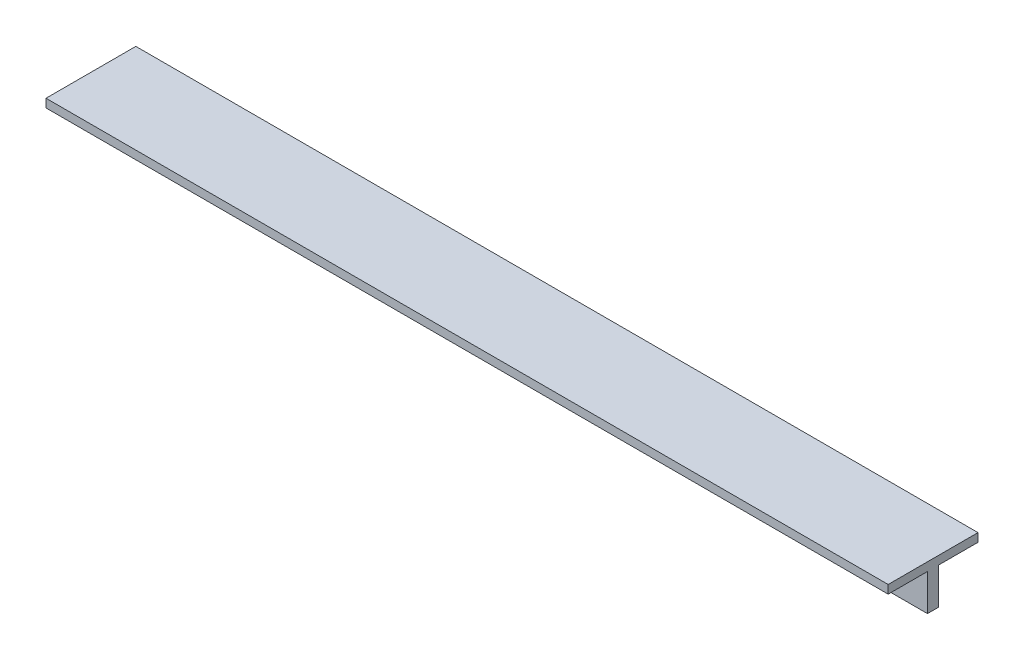
ISO-10303-21;
HEADER;
FILE_DESCRIPTION(('STEP AP214'),'2;1');
FILE_NAME('part.step','',(''),(''),'','','');
FILE_SCHEMA(('AUTOMOTIVE_DESIGN { 1 0 10303 214 1 1 1 1 }'));
ENDSEC;
DATA;
#1=APPLICATION_CONTEXT('core data for automotive mechanical design processes');
#2=APPLICATION_PROTOCOL_DEFINITION('international standard','automotive_design',2000,#1);
#3=PRODUCT_CONTEXT('',#1,'mechanical');
#4=PRODUCT('Part','Part','',(#3));
#5=PRODUCT_RELATED_PRODUCT_CATEGORY('part','',(#4));
#6=PRODUCT_DEFINITION_FORMATION('','',#4);
#7=PRODUCT_DEFINITION_CONTEXT('part definition',#1,'design');
#8=PRODUCT_DEFINITION('design','',#6,#7);
#9=PRODUCT_DEFINITION_SHAPE('','',#8);
#10=(LENGTH_UNIT() NAMED_UNIT(*) SI_UNIT(.MILLI.,.METRE.));
#11=(NAMED_UNIT(*) PLANE_ANGLE_UNIT() SI_UNIT($,.RADIAN.));
#12=(NAMED_UNIT(*) SI_UNIT($,.STERADIAN.) SOLID_ANGLE_UNIT());
#13=UNCERTAINTY_MEASURE_WITH_UNIT(LENGTH_MEASURE(1.E-05),#10,'distance_accuracy_value','');
#14=(GEOMETRIC_REPRESENTATION_CONTEXT(3) GLOBAL_UNCERTAINTY_ASSIGNED_CONTEXT((#13)) GLOBAL_UNIT_ASSIGNED_CONTEXT((#10,
#11,#12)) REPRESENTATION_CONTEXT('',''));
#15=CARTESIAN_POINT('',(0.,0.,0.));
#16=DIRECTION('',(0.,0.,1.));
#17=DIRECTION('',(1.,0.,0.));
#18=AXIS2_PLACEMENT_3D('',#15,#16,#17);
#19=CARTESIAN_POINT('',(75.,0.,-8.));
#20=DIRECTION('',(0.,-1.,0.));
#21=DIRECTION('',(0.,0.,-1.));
#22=AXIS2_PLACEMENT_3D('',#19,#20,#21);
#23=PLANE('',#22);
#24=DIRECTION('',(0.,0.,1.));
#25=VECTOR('',#24,1.);
#26=CARTESIAN_POINT('',(-75.,0.,-8.));
#27=LINE('',#26,#25);
#28=CARTESIAN_POINT('',(-75.,0.,-8.));
#29=VERTEX_POINT('',#28);
#30=CARTESIAN_POINT('',(-75.,0.,8.));
#31=VERTEX_POINT('',#30);
#32=EDGE_CURVE('E136',#29,#31,#27,.T.);
#33=ORIENTED_EDGE('',*,*,#32,.T.);
#34=DIRECTION('',(-1.,0.,0.));
#35=VECTOR('',#34,1.);
#36=CARTESIAN_POINT('',(75.,0.,8.));
#37=LINE('',#36,#35);
#38=CARTESIAN_POINT('',(75.,0.,8.));
#39=VERTEX_POINT('',#38);
#40=EDGE_CURVE('E185',#39,#31,#37,.T.);
#41=ORIENTED_EDGE('',*,*,#40,.F.);
#42=DIRECTION('',(0.,0.,1.));
#43=VECTOR('',#42,1.);
#44=CARTESIAN_POINT('',(75.,0.,-8.));
#45=LINE('',#44,#43);
#46=CARTESIAN_POINT('',(75.,0.,-8.));
#47=VERTEX_POINT('',#46);
#48=EDGE_CURVE('E118',#47,#39,#45,.T.);
#49=ORIENTED_EDGE('',*,*,#48,.F.);
#50=DIRECTION('',(-1.,0.,0.));
#51=VECTOR('',#50,1.);
#52=CARTESIAN_POINT('',(75.,0.,-8.));
#53=LINE('',#52,#51);
#54=EDGE_CURVE('E155',#47,#29,#53,.T.);
#55=ORIENTED_EDGE('',*,*,#54,.T.);
#56=EDGE_LOOP('',(#33,#41,#49,#55));
#57=FACE_BOUND('',#56,.T.);
#58=ADVANCED_FACE('F39',(#57),#23,.F.);
#59=CARTESIAN_POINT('',(75.,-8.,0.));
#60=DIRECTION('',(0.,1.,0.));
#61=DIRECTION('',(0.,0.,1.));
#62=AXIS2_PLACEMENT_3D('',#59,#60,#61);
#63=PLANE('',#62);
#64=DIRECTION('',(0.,0.,-1.));
#65=VECTOR('',#64,1.);
#66=CARTESIAN_POINT('',(-75.,-8.,0.));
#67=LINE('',#66,#65);
#68=CARTESIAN_POINT('',(-75.,-8.,0.999999999999999));
#69=VERTEX_POINT('',#68);
#70=CARTESIAN_POINT('',(-75.,-8.,-1.));
#71=VERTEX_POINT('',#70);
#72=EDGE_CURVE('E141',#69,#71,#67,.T.);
#73=ORIENTED_EDGE('',*,*,#72,.T.);
#74=DIRECTION('',(-1.,0.,0.));
#75=VECTOR('',#74,1.);
#76=CARTESIAN_POINT('',(75.,-8.,-1.));
#77=LINE('',#76,#75);
#78=CARTESIAN_POINT('',(75.,-8.,-1.));
#79=VERTEX_POINT('',#78);
#80=EDGE_CURVE('E11',#79,#71,#77,.T.);
#81=ORIENTED_EDGE('',*,*,#80,.F.);
#82=DIRECTION('',(0.,0.,-1.));
#83=VECTOR('',#82,1.);
#84=CARTESIAN_POINT('',(75.,-8.,0.));
#85=LINE('',#84,#83);
#86=CARTESIAN_POINT('',(75.,-8.,0.999999999999999));
#87=VERTEX_POINT('',#86);
#88=EDGE_CURVE('E87',#87,#79,#85,.T.);
#89=ORIENTED_EDGE('',*,*,#88,.F.);
#90=DIRECTION('',(-1.,0.,0.));
#91=VECTOR('',#90,1.);
#92=CARTESIAN_POINT('',(75.,-8.,0.999999999999999));
#93=LINE('',#92,#91);
#94=EDGE_CURVE('E114',#87,#69,#93,.T.);
#95=ORIENTED_EDGE('',*,*,#94,.T.);
#96=EDGE_LOOP('',(#73,#81,#89,#95));
#97=FACE_BOUND('',#96,.T.);
#98=ADVANCED_FACE('F112',(#97),#63,.F.);
#99=CARTESIAN_POINT('',(75.,-8.,-1.));
#100=DIRECTION('',(0.,0.,1.));
#101=DIRECTION('',(1.,0.,0.));
#102=AXIS2_PLACEMENT_3D('',#99,#100,#101);
#103=PLANE('',#102);
#104=DIRECTION('',(0.,1.,0.));
#105=VECTOR('',#104,1.);
#106=CARTESIAN_POINT('',(-75.,-8.,-1.));
#107=LINE('',#106,#105);
#108=CARTESIAN_POINT('',(-75.,-1.5,-1.));
#109=VERTEX_POINT('',#108);
#110=EDGE_CURVE('E159',#71,#109,#107,.T.);
#111=ORIENTED_EDGE('',*,*,#110,.T.);
#112=DIRECTION('',(-1.,0.,0.));
#113=VECTOR('',#112,1.);
#114=CARTESIAN_POINT('',(75.,-1.5,-1.));
#115=LINE('',#114,#113);
#116=CARTESIAN_POINT('',(75.,-1.5,-1.));
#117=VERTEX_POINT('',#116);
#118=EDGE_CURVE('E48',#117,#109,#115,.T.);
#119=ORIENTED_EDGE('',*,*,#118,.F.);
#120=DIRECTION('',(0.,1.,0.));
#121=VECTOR('',#120,1.);
#122=CARTESIAN_POINT('',(75.,-8.,-1.));
#123=LINE('',#122,#121);
#124=EDGE_CURVE('E117',#79,#117,#123,.T.);
#125=ORIENTED_EDGE('',*,*,#124,.F.);
#126=ORIENTED_EDGE('',*,*,#80,.T.);
#127=EDGE_LOOP('',(#111,#119,#125,#126));
#128=FACE_BOUND('',#127,.T.);
#129=ADVANCED_FACE('F194',(#128),#103,.F.);
#130=CARTESIAN_POINT('',(75.,-1.5,-1.));
#131=DIRECTION('',(0.,1.,0.));
#132=DIRECTION('',(0.,0.,1.));
#133=AXIS2_PLACEMENT_3D('',#130,#131,#132);
#134=PLANE('',#133);
#135=DIRECTION('',(0.,0.,-1.));
#136=VECTOR('',#135,1.);
#137=CARTESIAN_POINT('',(-75.,-1.5,-1.));
#138=LINE('',#137,#136);
#139=CARTESIAN_POINT('',(-75.,-1.5,-8.));
#140=VERTEX_POINT('',#139);
#141=EDGE_CURVE('E74',#109,#140,#138,.T.);
#142=ORIENTED_EDGE('',*,*,#141,.T.);
#143=DIRECTION('',(-1.,0.,0.));
#144=VECTOR('',#143,1.);
#145=CARTESIAN_POINT('',(75.,-1.5,-8.));
#146=LINE('',#145,#144);
#147=CARTESIAN_POINT('',(75.,-1.5,-8.));
#148=VERTEX_POINT('',#147);
#149=EDGE_CURVE('E168',#148,#140,#146,.T.);
#150=ORIENTED_EDGE('',*,*,#149,.F.);
#151=DIRECTION('',(0.,0.,-1.));
#152=VECTOR('',#151,1.);
#153=CARTESIAN_POINT('',(75.,-1.5,-1.));
#154=LINE('',#153,#152);
#155=EDGE_CURVE('E151',#117,#148,#154,.T.);
#156=ORIENTED_EDGE('',*,*,#155,.F.);
#157=ORIENTED_EDGE('',*,*,#118,.T.);
#158=EDGE_LOOP('',(#142,#150,#156,#157));
#159=FACE_BOUND('',#158,.T.);
#160=ADVANCED_FACE('F173',(#159),#134,.F.);
#161=CARTESIAN_POINT('',(75.,-1.5,-8.));
#162=DIRECTION('',(0.,0.,1.));
#163=DIRECTION('',(1.,0.,0.));
#164=AXIS2_PLACEMENT_3D('',#161,#162,#163);
#165=PLANE('',#164);
#166=DIRECTION('',(0.,1.,0.));
#167=VECTOR('',#166,1.);
#168=CARTESIAN_POINT('',(-75.,-1.5,-8.));
#169=LINE('',#168,#167);
#170=EDGE_CURVE('E80',#140,#29,#169,.T.);
#171=ORIENTED_EDGE('',*,*,#170,.T.);
#172=ORIENTED_EDGE('',*,*,#54,.F.);
#173=DIRECTION('',(0.,1.,0.));
#174=VECTOR('',#173,1.);
#175=CARTESIAN_POINT('',(75.,-1.5,-8.));
#176=LINE('',#175,#174);
#177=EDGE_CURVE('E56',#148,#47,#176,.T.);
#178=ORIENTED_EDGE('',*,*,#177,.F.);
#179=ORIENTED_EDGE('',*,*,#149,.T.);
#180=EDGE_LOOP('',(#171,#172,#178,#179));
#181=FACE_BOUND('',#180,.T.);
#182=ADVANCED_FACE('F186',(#181),#165,.F.);
#183=CARTESIAN_POINT('',(75.,0.,0.));
#184=DIRECTION('',(1.,0.,0.));
#185=DIRECTION('',(0.,0.,-1.));
#186=AXIS2_PLACEMENT_3D('',#183,#184,#185);
#187=PLANE('',#186);
#188=ORIENTED_EDGE('',*,*,#48,.T.);
#189=DIRECTION('',(0.,1.,0.));
#190=VECTOR('',#189,1.);
#191=CARTESIAN_POINT('',(75.,-1.5,8.));
#192=LINE('',#191,#190);
#193=CARTESIAN_POINT('',(75.,-1.5,8.));
#194=VERTEX_POINT('',#193);
#195=EDGE_CURVE('E291',#194,#39,#192,.T.);
#196=ORIENTED_EDGE('',*,*,#195,.F.);
#197=DIRECTION('',(0.,0.,1.));
#198=VECTOR('',#197,1.);
#199=CARTESIAN_POINT('',(75.,-1.5,1.));
#200=LINE('',#199,#198);
#201=CARTESIAN_POINT('',(75.,-1.5,1.));
#202=VERTEX_POINT('',#201);
#203=EDGE_CURVE('E124',#202,#194,#200,.T.);
#204=ORIENTED_EDGE('',*,*,#203,.F.);
#205=DIRECTION('',(0.,1.,0.));
#206=VECTOR('',#205,1.);
#207=CARTESIAN_POINT('',(75.,-8.,0.999999999999999));
#208=LINE('',#207,#206);
#209=EDGE_CURVE('E121',#87,#202,#208,.T.);
#210=ORIENTED_EDGE('',*,*,#209,.F.);
#211=ORIENTED_EDGE('',*,*,#88,.T.);
#212=ORIENTED_EDGE('',*,*,#124,.T.);
#213=ORIENTED_EDGE('',*,*,#155,.T.);
#214=ORIENTED_EDGE('',*,*,#177,.T.);
#215=EDGE_LOOP('',(#188,#196,#204,#210,#211,#212,#213,#214));
#216=FACE_BOUND('',#215,.T.);
#217=ADVANCED_FACE('F122',(#216),#187,.T.);
#218=CARTESIAN_POINT('',(-75.,0.,0.));
#219=DIRECTION('',(1.,0.,0.));
#220=DIRECTION('',(0.,0.,-1.));
#221=AXIS2_PLACEMENT_3D('',#218,#219,#220);
#222=PLANE('',#221);
#223=ORIENTED_EDGE('',*,*,#32,.F.);
#224=ORIENTED_EDGE('',*,*,#170,.F.);
#225=ORIENTED_EDGE('',*,*,#141,.F.);
#226=ORIENTED_EDGE('',*,*,#110,.F.);
#227=ORIENTED_EDGE('',*,*,#72,.F.);
#228=DIRECTION('',(0.,1.,0.));
#229=VECTOR('',#228,1.);
#230=CARTESIAN_POINT('',(-75.,-8.,0.999999999999999));
#231=LINE('',#230,#229);
#232=CARTESIAN_POINT('',(-75.,-1.5,1.));
#233=VERTEX_POINT('',#232);
#234=EDGE_CURVE('E134',#69,#233,#231,.T.);
#235=ORIENTED_EDGE('',*,*,#234,.T.);
#236=DIRECTION('',(0.,0.,1.));
#237=VECTOR('',#236,1.);
#238=CARTESIAN_POINT('',(-75.,-1.5,1.));
#239=LINE('',#238,#237);
#240=CARTESIAN_POINT('',(-75.,-1.5,8.));
#241=VERTEX_POINT('',#240);
#242=EDGE_CURVE('E281',#233,#241,#239,.T.);
#243=ORIENTED_EDGE('',*,*,#242,.T.);
#244=DIRECTION('',(0.,1.,0.));
#245=VECTOR('',#244,1.);
#246=CARTESIAN_POINT('',(-75.,-1.5,8.));
#247=LINE('',#246,#245);
#248=EDGE_CURVE('E129',#241,#31,#247,.T.);
#249=ORIENTED_EDGE('',*,*,#248,.T.);
#250=EDGE_LOOP('',(#223,#224,#225,#226,#227,#235,#243,#249));
#251=FACE_BOUND('',#250,.T.);
#252=ADVANCED_FACE('F178',(#251),#222,.F.);
#253=CARTESIAN_POINT('',(75.,-8.,0.999999999999999));
#254=DIRECTION('',(0.,0.,-1.));
#255=DIRECTION('',(1.,0.,0.));
#256=AXIS2_PLACEMENT_3D('',#253,#254,#255);
#257=PLANE('',#256);
#258=ORIENTED_EDGE('',*,*,#234,.F.);
#259=ORIENTED_EDGE('',*,*,#94,.F.);
#260=ORIENTED_EDGE('',*,*,#209,.T.);
#261=DIRECTION('',(-1.,0.,0.));
#262=VECTOR('',#261,1.);
#263=CARTESIAN_POINT('',(75.,-1.5,1.));
#264=LINE('',#263,#262);
#265=EDGE_CURVE('E137',#202,#233,#264,.T.);
#266=ORIENTED_EDGE('',*,*,#265,.T.);
#267=EDGE_LOOP('',(#258,#259,#260,#266));
#268=FACE_BOUND('',#267,.T.);
#269=ADVANCED_FACE('F132',(#268),#257,.F.);
#270=CARTESIAN_POINT('',(75.,-1.5,1.));
#271=DIRECTION('',(0.,1.,0.));
#272=DIRECTION('',(0.,0.,-1.));
#273=AXIS2_PLACEMENT_3D('',#270,#271,#272);
#274=PLANE('',#273);
#275=ORIENTED_EDGE('',*,*,#242,.F.);
#276=ORIENTED_EDGE('',*,*,#265,.F.);
#277=ORIENTED_EDGE('',*,*,#203,.T.);
#278=DIRECTION('',(-1.,0.,0.));
#279=VECTOR('',#278,1.);
#280=CARTESIAN_POINT('',(75.,-1.5,8.));
#281=LINE('',#280,#279);
#282=EDGE_CURVE('E143',#194,#241,#281,.T.);
#283=ORIENTED_EDGE('',*,*,#282,.T.);
#284=EDGE_LOOP('',(#275,#276,#277,#283));
#285=FACE_BOUND('',#284,.T.);
#286=ADVANCED_FACE('F253',(#285),#274,.F.);
#287=CARTESIAN_POINT('',(75.,-1.5,8.));
#288=DIRECTION('',(0.,0.,-1.));
#289=DIRECTION('',(1.,0.,0.));
#290=AXIS2_PLACEMENT_3D('',#287,#288,#289);
#291=PLANE('',#290);
#292=ORIENTED_EDGE('',*,*,#248,.F.);
#293=ORIENTED_EDGE('',*,*,#282,.F.);
#294=ORIENTED_EDGE('',*,*,#195,.T.);
#295=ORIENTED_EDGE('',*,*,#40,.T.);
#296=EDGE_LOOP('',(#292,#293,#294,#295));
#297=FACE_BOUND('',#296,.T.);
#298=ADVANCED_FACE('F261',(#297),#291,.F.);
#299=CLOSED_SHELL('',(#58,#98,#129,#160,#182,#217,#252,#269,#286,#298));
#300=MANIFOLD_SOLID_BREP('B2',#299);
#301=ADVANCED_BREP_SHAPE_REPRESENTATION('',(#18,#300),#14);
#302=SHAPE_DEFINITION_REPRESENTATION(#9,#301);
ENDSEC;
END-ISO-10303-21;
